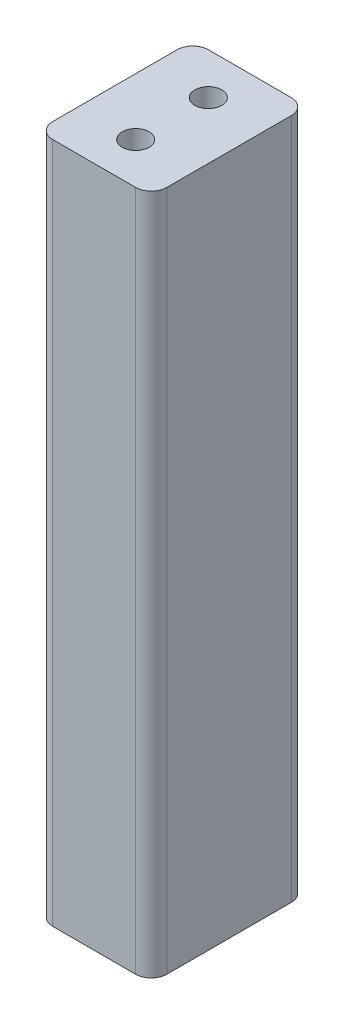
ISO-10303-21;
HEADER;
FILE_DESCRIPTION(('STEP AP214'),'2;1');
FILE_NAME('part.step','',(''),(''),'','','');
FILE_SCHEMA(('AUTOMOTIVE_DESIGN { 1 0 10303 214 1 1 1 1 }'));
ENDSEC;
DATA;
#1=APPLICATION_CONTEXT('core data for automotive mechanical design processes');
#2=APPLICATION_PROTOCOL_DEFINITION('international standard','automotive_design',2000,#1);
#3=PRODUCT_CONTEXT('',#1,'mechanical');
#4=PRODUCT('Part','Part','',(#3));
#5=PRODUCT_RELATED_PRODUCT_CATEGORY('part','',(#4));
#6=PRODUCT_DEFINITION_FORMATION('','',#4);
#7=PRODUCT_DEFINITION_CONTEXT('part definition',#1,'design');
#8=PRODUCT_DEFINITION('design','',#6,#7);
#9=PRODUCT_DEFINITION_SHAPE('','',#8);
#10=(LENGTH_UNIT() NAMED_UNIT(*) SI_UNIT(.MILLI.,.METRE.));
#11=(NAMED_UNIT(*) PLANE_ANGLE_UNIT() SI_UNIT($,.RADIAN.));
#12=(NAMED_UNIT(*) SI_UNIT($,.STERADIAN.) SOLID_ANGLE_UNIT());
#13=UNCERTAINTY_MEASURE_WITH_UNIT(LENGTH_MEASURE(1.E-05),#10,'distance_accuracy_value','');
#14=(GEOMETRIC_REPRESENTATION_CONTEXT(3) GLOBAL_UNCERTAINTY_ASSIGNED_CONTEXT((#13)) GLOBAL_UNIT_ASSIGNED_CONTEXT((#10,
#11,#12)) REPRESENTATION_CONTEXT('',''));
#15=CARTESIAN_POINT('',(0.,0.,0.));
#16=DIRECTION('',(0.,0.,1.));
#17=DIRECTION('',(1.,0.,0.));
#18=AXIS2_PLACEMENT_3D('',#15,#16,#17);
#19=CARTESIAN_POINT('',(18.5,509.69,466.5));
#20=DIRECTION('',(0.,-1.,0.));
#21=DIRECTION('',(0.,0.,-1.));
#22=AXIS2_PLACEMENT_3D('',#19,#20,#21);
#23=PLANE('',#22);
#24=CARTESIAN_POINT('',(18.5,509.69,466.5));
#25=DIRECTION('',(0.,-1.,0.));
#26=DIRECTION('',(1.,0.,0.));
#27=AXIS2_PLACEMENT_3D('',#24,#25,#26);
#28=CIRCLE('',#27,1.3);
#29=CARTESIAN_POINT('',(19.8,509.69,466.5));
#30=VERTEX_POINT('',#29);
#31=EDGE_CURVE('E9',#30,#30,#28,.T.);
#32=ORIENTED_EDGE('',*,*,#31,.F.);
#33=EDGE_LOOP('',(#32));
#34=FACE_BOUND('',#33,.T.);
#35=ADVANCED_FACE('F15',(#34),#23,.F.);
#36=CARTESIAN_POINT('',(18.5,509.69,459.5));
#37=DIRECTION('',(0.,-1.,0.));
#38=DIRECTION('',(0.,0.,-1.));
#39=AXIS2_PLACEMENT_3D('',#36,#37,#38);
#40=PLANE('',#39);
#41=CARTESIAN_POINT('',(18.5,509.69,459.5));
#42=DIRECTION('',(0.,-1.,0.));
#43=DIRECTION('',(1.,0.,0.));
#44=AXIS2_PLACEMENT_3D('',#41,#42,#43);
#45=CIRCLE('',#44,1.3);
#46=CARTESIAN_POINT('',(19.8,509.69,459.5));
#47=VERTEX_POINT('',#46);
#48=EDGE_CURVE('E43',#47,#47,#45,.T.);
#49=ORIENTED_EDGE('',*,*,#48,.F.);
#50=EDGE_LOOP('',(#49));
#51=FACE_BOUND('',#50,.T.);
#52=ADVANCED_FACE('F17',(#51),#40,.F.);
#53=CARTESIAN_POINT('',(18.5,471.,463.));
#54=DIRECTION('',(0.,-1.,0.));
#55=DIRECTION('',(0.,0.,-1.));
#56=AXIS2_PLACEMENT_3D('',#53,#54,#55);
#57=PLANE('',#56);
#58=CARTESIAN_POINT('',(18.5,471.,463.));
#59=DIRECTION('',(0.,-1.,0.));
#60=DIRECTION('',(1.,0.,0.));
#61=AXIS2_PLACEMENT_3D('',#58,#59,#60);
#62=CIRCLE('',#61,1.3);
#63=CARTESIAN_POINT('',(19.8,471.,463.));
#64=VERTEX_POINT('',#63);
#65=EDGE_CURVE('E243',#64,#64,#62,.T.);
#66=ORIENTED_EDGE('',*,*,#65,.T.);
#67=EDGE_LOOP('',(#66));
#68=FACE_BOUND('',#67,.T.);
#69=ADVANCED_FACE('F294',(#68),#57,.T.);
#70=CARTESIAN_POINT('',(18.5,509.69,466.5));
#71=DIRECTION('',(0.,-1.,0.));
#72=DIRECTION('',(1.,0.,0.));
#73=AXIS2_PLACEMENT_3D('',#70,#71,#72);
#74=CYLINDRICAL_SURFACE('',#73,1.3);
#75=DIRECTION('',(0.,1.,0.));
#76=VECTOR('',#75,1.);
#77=CARTESIAN_POINT('',(19.8,509.69,466.5));
#78=LINE('',#77,#76);
#79=CARTESIAN_POINT('',(19.8,524.69,466.5));
#80=VERTEX_POINT('',#79);
#81=EDGE_CURVE('E24',#30,#80,#78,.T.);
#82=ORIENTED_EDGE('',*,*,#81,.T.);
#83=CARTESIAN_POINT('',(18.5,524.69,466.5));
#84=DIRECTION('',(0.,-1.,0.));
#85=DIRECTION('',(1.,0.,0.));
#86=AXIS2_PLACEMENT_3D('',#83,#84,#85);
#87=CIRCLE('',#86,1.3);
#88=EDGE_CURVE('E229',#80,#80,#87,.T.);
#89=ORIENTED_EDGE('',*,*,#88,.F.);
#90=ORIENTED_EDGE('',*,*,#81,.F.);
#91=ORIENTED_EDGE('',*,*,#31,.T.);
#92=EDGE_LOOP('',(#82,#89,#90,#91));
#93=FACE_BOUND('',#92,.T.);
#94=ADVANCED_FACE('F303',(#93),#74,.F.);
#95=CARTESIAN_POINT('',(18.5,509.69,459.5));
#96=DIRECTION('',(0.,-1.,0.));
#97=DIRECTION('',(1.,0.,0.));
#98=AXIS2_PLACEMENT_3D('',#95,#96,#97);
#99=CYLINDRICAL_SURFACE('',#98,1.3);
#100=DIRECTION('',(0.,1.,0.));
#101=VECTOR('',#100,1.);
#102=CARTESIAN_POINT('',(19.8,509.69,459.5));
#103=LINE('',#102,#101);
#104=CARTESIAN_POINT('',(19.8,524.69,459.5));
#105=VERTEX_POINT('',#104);
#106=EDGE_CURVE('E202',#47,#105,#103,.T.);
#107=ORIENTED_EDGE('',*,*,#106,.T.);
#108=CARTESIAN_POINT('',(18.5,524.69,459.5));
#109=DIRECTION('',(0.,-1.,0.));
#110=DIRECTION('',(1.,0.,0.));
#111=AXIS2_PLACEMENT_3D('',#108,#109,#110);
#112=CIRCLE('',#111,1.3);
#113=EDGE_CURVE('E225',#105,#105,#112,.T.);
#114=ORIENTED_EDGE('',*,*,#113,.F.);
#115=ORIENTED_EDGE('',*,*,#106,.F.);
#116=ORIENTED_EDGE('',*,*,#48,.T.);
#117=EDGE_LOOP('',(#107,#114,#115,#116));
#118=FACE_BOUND('',#117,.T.);
#119=ADVANCED_FACE('F254',(#118),#99,.F.);
#120=CARTESIAN_POINT('',(18.5,458.,463.));
#121=DIRECTION('',(0.,-1.,0.));
#122=DIRECTION('',(1.,0.,0.));
#123=AXIS2_PLACEMENT_3D('',#120,#121,#122);
#124=CYLINDRICAL_SURFACE('',#123,1.3);
#125=DIRECTION('',(0.,1.,0.));
#126=VECTOR('',#125,1.);
#127=CARTESIAN_POINT('',(19.8,458.,463.));
#128=LINE('',#127,#126);
#129=CARTESIAN_POINT('',(19.8,459.,463.));
#130=VERTEX_POINT('',#129);
#131=EDGE_CURVE('E246',#130,#64,#128,.T.);
#132=ORIENTED_EDGE('',*,*,#131,.T.);
#133=ORIENTED_EDGE('',*,*,#65,.F.);
#134=ORIENTED_EDGE('',*,*,#131,.F.);
#135=CARTESIAN_POINT('',(18.5,459.,463.));
#136=DIRECTION('',(0.,-1.,0.));
#137=DIRECTION('',(1.,0.,0.));
#138=AXIS2_PLACEMENT_3D('',#135,#136,#137);
#139=CIRCLE('',#138,1.3);
#140=EDGE_CURVE('E168',#130,#130,#139,.T.);
#141=ORIENTED_EDGE('',*,*,#140,.T.);
#142=EDGE_LOOP('',(#132,#133,#134,#141));
#143=FACE_BOUND('',#142,.T.);
#144=ADVANCED_FACE('F301',(#143),#124,.F.);
#145=CARTESIAN_POINT('',(13.,459.,470.5));
#146=DIRECTION('',(0.,0.,1.));
#147=DIRECTION('',(1.,0.,0.));
#148=AXIS2_PLACEMENT_3D('',#145,#146,#147);
#149=PLANE('',#148);
#150=DIRECTION('',(1.,0.,0.));
#151=VECTOR('',#150,1.);
#152=CARTESIAN_POINT('',(13.,524.69,470.5));
#153=LINE('',#152,#151);
#154=CARTESIAN_POINT('',(14.5,524.69,470.5));
#155=VERTEX_POINT('',#154);
#156=CARTESIAN_POINT('',(22.5,524.69,470.5));
#157=VERTEX_POINT('',#156);
#158=EDGE_CURVE('E209',#155,#157,#153,.T.);
#159=ORIENTED_EDGE('',*,*,#158,.F.);
#160=DIRECTION('',(0.,1.,0.));
#161=VECTOR('',#160,1.);
#162=CARTESIAN_POINT('',(14.5,459.,470.5));
#163=LINE('',#162,#161);
#164=CARTESIAN_POINT('',(14.5,459.,470.5));
#165=VERTEX_POINT('',#164);
#166=EDGE_CURVE('E190',#165,#155,#163,.T.);
#167=ORIENTED_EDGE('',*,*,#166,.F.);
#168=DIRECTION('',(1.,0.,0.));
#169=VECTOR('',#168,1.);
#170=CARTESIAN_POINT('',(13.,459.,470.5));
#171=LINE('',#170,#169);
#172=CARTESIAN_POINT('',(22.5,459.,470.5));
#173=VERTEX_POINT('',#172);
#174=EDGE_CURVE('E135',#165,#173,#171,.T.);
#175=ORIENTED_EDGE('',*,*,#174,.T.);
#176=DIRECTION('',(0.,1.,0.));
#177=VECTOR('',#176,1.);
#178=CARTESIAN_POINT('',(22.5,459.,470.5));
#179=LINE('',#178,#177);
#180=EDGE_CURVE('E242',#173,#157,#179,.T.);
#181=ORIENTED_EDGE('',*,*,#180,.T.);
#182=EDGE_LOOP('',(#159,#167,#175,#181));
#183=FACE_BOUND('',#182,.T.);
#184=ADVANCED_FACE('F270',(#183),#149,.T.);
#185=CARTESIAN_POINT('',(22.5,459.,469.));
#186=DIRECTION('',(0.,1.,0.));
#187=DIRECTION('',(1.,0.,0.));
#188=AXIS2_PLACEMENT_3D('',#185,#186,#187);
#189=CYLINDRICAL_SURFACE('',#188,1.5);
#190=DIRECTION('',(0.,1.,0.));
#191=VECTOR('',#190,1.);
#192=CARTESIAN_POINT('',(24.,459.,469.));
#193=LINE('',#192,#191);
#194=CARTESIAN_POINT('',(24.,459.,469.));
#195=VERTEX_POINT('',#194);
#196=CARTESIAN_POINT('',(24.,524.69,469.));
#197=VERTEX_POINT('',#196);
#198=EDGE_CURVE('E239',#195,#197,#193,.T.);
#199=ORIENTED_EDGE('',*,*,#198,.T.);
#200=CARTESIAN_POINT('',(22.5,524.69,469.));
#201=DIRECTION('',(0.,-1.,0.));
#202=DIRECTION('',(0.,0.,1.));
#203=AXIS2_PLACEMENT_3D('',#200,#201,#202);
#204=CIRCLE('',#203,1.5);
#205=EDGE_CURVE('E213',#197,#157,#204,.T.);
#206=ORIENTED_EDGE('',*,*,#205,.T.);
#207=ORIENTED_EDGE('',*,*,#180,.F.);
#208=CARTESIAN_POINT('',(22.5,459.,469.));
#209=DIRECTION('',(0.,-1.,0.));
#210=DIRECTION('',(0.,0.,1.));
#211=AXIS2_PLACEMENT_3D('',#208,#209,#210);
#212=CIRCLE('',#211,1.5);
#213=EDGE_CURVE('E183',#195,#173,#212,.T.);
#214=ORIENTED_EDGE('',*,*,#213,.F.);
#215=EDGE_LOOP('',(#199,#206,#207,#214));
#216=FACE_BOUND('',#215,.T.);
#217=ADVANCED_FACE('F273',(#216),#189,.T.);
#218=CARTESIAN_POINT('',(24.,459.,455.5));
#219=DIRECTION('',(1.,0.,0.));
#220=DIRECTION('',(0.,1.,0.));
#221=AXIS2_PLACEMENT_3D('',#218,#219,#220);
#222=PLANE('',#221);
#223=DIRECTION('',(0.,0.,1.));
#224=VECTOR('',#223,1.);
#225=CARTESIAN_POINT('',(24.,459.,455.5));
#226=LINE('',#225,#224);
#227=CARTESIAN_POINT('',(24.,459.,457.));
#228=VERTEX_POINT('',#227);
#229=EDGE_CURVE('E176',#228,#195,#226,.T.);
#230=ORIENTED_EDGE('',*,*,#229,.F.);
#231=DIRECTION('',(0.,1.,0.));
#232=VECTOR('',#231,1.);
#233=CARTESIAN_POINT('',(24.,459.,457.));
#234=LINE('',#233,#232);
#235=CARTESIAN_POINT('',(24.,524.69,457.));
#236=VERTEX_POINT('',#235);
#237=EDGE_CURVE('E236',#228,#236,#234,.T.);
#238=ORIENTED_EDGE('',*,*,#237,.T.);
#239=DIRECTION('',(0.,0.,1.));
#240=VECTOR('',#239,1.);
#241=CARTESIAN_POINT('',(24.,524.69,455.5));
#242=LINE('',#241,#240);
#243=EDGE_CURVE('E217',#236,#197,#242,.T.);
#244=ORIENTED_EDGE('',*,*,#243,.T.);
#245=ORIENTED_EDGE('',*,*,#198,.F.);
#246=EDGE_LOOP('',(#230,#238,#244,#245));
#247=FACE_BOUND('',#246,.T.);
#248=ADVANCED_FACE('F276',(#247),#222,.T.);
#249=CARTESIAN_POINT('',(22.5,459.,457.));
#250=DIRECTION('',(0.,1.,0.));
#251=DIRECTION('',(1.,0.,0.));
#252=AXIS2_PLACEMENT_3D('',#249,#250,#251);
#253=CYLINDRICAL_SURFACE('',#252,1.5);
#254=CARTESIAN_POINT('',(22.5,459.,457.));
#255=DIRECTION('',(0.,1.,0.));
#256=DIRECTION('',(0.,0.,1.));
#257=AXIS2_PLACEMENT_3D('',#254,#255,#256);
#258=CIRCLE('',#257,1.5);
#259=CARTESIAN_POINT('',(22.5,459.,455.5));
#260=VERTEX_POINT('',#259);
#261=EDGE_CURVE('E150',#228,#260,#258,.T.);
#262=ORIENTED_EDGE('',*,*,#261,.T.);
#263=DIRECTION('',(0.,1.,0.));
#264=VECTOR('',#263,1.);
#265=CARTESIAN_POINT('',(22.5,459.,455.5));
#266=LINE('',#265,#264);
#267=CARTESIAN_POINT('',(22.5,524.69,455.5));
#268=VERTEX_POINT('',#267);
#269=EDGE_CURVE('E233',#260,#268,#266,.T.);
#270=ORIENTED_EDGE('',*,*,#269,.T.);
#271=CARTESIAN_POINT('',(22.5,524.69,457.));
#272=DIRECTION('',(0.,1.,0.));
#273=DIRECTION('',(0.,0.,1.));
#274=AXIS2_PLACEMENT_3D('',#271,#272,#273);
#275=CIRCLE('',#274,1.5);
#276=EDGE_CURVE('E221',#236,#268,#275,.T.);
#277=ORIENTED_EDGE('',*,*,#276,.F.);
#278=ORIENTED_EDGE('',*,*,#237,.F.);
#279=EDGE_LOOP('',(#262,#270,#277,#278));
#280=FACE_BOUND('',#279,.T.);
#281=ADVANCED_FACE('F278',(#280),#253,.T.);
#282=CARTESIAN_POINT('',(13.,459.,455.5));
#283=DIRECTION('',(0.,0.,1.));
#284=DIRECTION('',(1.,0.,0.));
#285=AXIS2_PLACEMENT_3D('',#282,#283,#284);
#286=PLANE('',#285);
#287=ORIENTED_EDGE('',*,*,#269,.F.);
#288=DIRECTION('',(1.,0.,0.));
#289=VECTOR('',#288,1.);
#290=CARTESIAN_POINT('',(13.,459.,455.5));
#291=LINE('',#290,#289);
#292=CARTESIAN_POINT('',(14.5,459.,455.5));
#293=VERTEX_POINT('',#292);
#294=EDGE_CURVE('E166',#293,#260,#291,.T.);
#295=ORIENTED_EDGE('',*,*,#294,.F.);
#296=DIRECTION('',(0.,1.,0.));
#297=VECTOR('',#296,1.);
#298=CARTESIAN_POINT('',(14.5,459.,455.5));
#299=LINE('',#298,#297);
#300=CARTESIAN_POINT('',(14.5,524.69,455.5));
#301=VERTEX_POINT('',#300);
#302=EDGE_CURVE('E193',#293,#301,#299,.T.);
#303=ORIENTED_EDGE('',*,*,#302,.T.);
#304=DIRECTION('',(1.,0.,0.));
#305=VECTOR('',#304,1.);
#306=CARTESIAN_POINT('',(13.,524.69,455.5));
#307=LINE('',#306,#305);
#308=EDGE_CURVE('E205',#301,#268,#307,.T.);
#309=ORIENTED_EDGE('',*,*,#308,.T.);
#310=EDGE_LOOP('',(#287,#295,#303,#309));
#311=FACE_BOUND('',#310,.T.);
#312=ADVANCED_FACE('F259',(#311),#286,.F.);
#313=CARTESIAN_POINT('',(13.,524.69,455.5));
#314=DIRECTION('',(0.,1.,0.));
#315=DIRECTION('',(1.,0.,0.));
#316=AXIS2_PLACEMENT_3D('',#313,#314,#315);
#317=PLANE('',#316);
#318=ORIENTED_EDGE('',*,*,#88,.T.);
#319=EDGE_LOOP('',(#318));
#320=FACE_BOUND('',#319,.T.);
#321=ORIENTED_EDGE('',*,*,#113,.T.);
#322=EDGE_LOOP('',(#321));
#323=FACE_BOUND('',#322,.T.);
#324=ORIENTED_EDGE('',*,*,#308,.F.);
#325=CARTESIAN_POINT('',(14.5,524.69,457.));
#326=DIRECTION('',(0.,-1.,0.));
#327=DIRECTION('',(0.,0.,1.));
#328=AXIS2_PLACEMENT_3D('',#325,#326,#327);
#329=CIRCLE('',#328,1.5);
#330=CARTESIAN_POINT('',(13.,524.69,457.));
#331=VERTEX_POINT('',#330);
#332=EDGE_CURVE('E172',#331,#301,#329,.T.);
#333=ORIENTED_EDGE('',*,*,#332,.F.);
#334=DIRECTION('',(0.,0.,1.));
#335=VECTOR('',#334,1.);
#336=CARTESIAN_POINT('',(13.,524.69,455.5));
#337=LINE('',#336,#335);
#338=CARTESIAN_POINT('',(13.,524.69,469.));
#339=VERTEX_POINT('',#338);
#340=EDGE_CURVE('E157',#331,#339,#337,.T.);
#341=ORIENTED_EDGE('',*,*,#340,.T.);
#342=CARTESIAN_POINT('',(14.5,524.69,469.));
#343=DIRECTION('',(0.,1.,0.));
#344=DIRECTION('',(0.,0.,1.));
#345=AXIS2_PLACEMENT_3D('',#342,#343,#344);
#346=CIRCLE('',#345,1.5);
#347=EDGE_CURVE('E154',#339,#155,#346,.T.);
#348=ORIENTED_EDGE('',*,*,#347,.T.);
#349=ORIENTED_EDGE('',*,*,#158,.T.);
#350=ORIENTED_EDGE('',*,*,#205,.F.);
#351=ORIENTED_EDGE('',*,*,#243,.F.);
#352=ORIENTED_EDGE('',*,*,#276,.T.);
#353=EDGE_LOOP('',(#324,#333,#341,#348,#349,#350,#351,#352));
#354=FACE_BOUND('',#353,.T.);
#355=ADVANCED_FACE('F256',(#320,#323,#354),#317,.T.);
#356=CARTESIAN_POINT('',(14.5,459.,469.));
#357=DIRECTION('',(0.,1.,0.));
#358=DIRECTION('',(-1.,0.,0.));
#359=AXIS2_PLACEMENT_3D('',#356,#357,#358);
#360=CYLINDRICAL_SURFACE('',#359,1.5);
#361=CARTESIAN_POINT('',(14.5,459.,469.));
#362=DIRECTION('',(0.,1.,0.));
#363=DIRECTION('',(0.,0.,1.));
#364=AXIS2_PLACEMENT_3D('',#361,#362,#363);
#365=CIRCLE('',#364,1.5);
#366=CARTESIAN_POINT('',(13.,459.,469.));
#367=VERTEX_POINT('',#366);
#368=EDGE_CURVE('E126',#367,#165,#365,.T.);
#369=ORIENTED_EDGE('',*,*,#368,.T.);
#370=ORIENTED_EDGE('',*,*,#166,.T.);
#371=ORIENTED_EDGE('',*,*,#347,.F.);
#372=DIRECTION('',(0.,1.,0.));
#373=VECTOR('',#372,1.);
#374=CARTESIAN_POINT('',(13.,459.,469.));
#375=LINE('',#374,#373);
#376=EDGE_CURVE('E146',#367,#339,#375,.T.);
#377=ORIENTED_EDGE('',*,*,#376,.F.);
#378=EDGE_LOOP('',(#369,#370,#371,#377));
#379=FACE_BOUND('',#378,.T.);
#380=ADVANCED_FACE('F152',(#379),#360,.T.);
#381=CARTESIAN_POINT('',(14.5,459.,457.));
#382=DIRECTION('',(0.,1.,0.));
#383=DIRECTION('',(-1.,0.,0.));
#384=AXIS2_PLACEMENT_3D('',#381,#382,#383);
#385=CYLINDRICAL_SURFACE('',#384,1.5);
#386=DIRECTION('',(0.,1.,0.));
#387=VECTOR('',#386,1.);
#388=CARTESIAN_POINT('',(13.,459.,457.));
#389=LINE('',#388,#387);
#390=CARTESIAN_POINT('',(13.,459.,457.));
#391=VERTEX_POINT('',#390);
#392=EDGE_CURVE('E148',#391,#331,#389,.T.);
#393=ORIENTED_EDGE('',*,*,#392,.T.);
#394=ORIENTED_EDGE('',*,*,#332,.T.);
#395=ORIENTED_EDGE('',*,*,#302,.F.);
#396=CARTESIAN_POINT('',(14.5,459.,457.));
#397=DIRECTION('',(0.,-1.,0.));
#398=DIRECTION('',(0.,0.,1.));
#399=AXIS2_PLACEMENT_3D('',#396,#397,#398);
#400=CIRCLE('',#399,1.5);
#401=EDGE_CURVE('E140',#391,#293,#400,.T.);
#402=ORIENTED_EDGE('',*,*,#401,.F.);
#403=EDGE_LOOP('',(#393,#394,#395,#402));
#404=FACE_BOUND('',#403,.T.);
#405=ADVANCED_FACE('F267',(#404),#385,.T.);
#406=CARTESIAN_POINT('',(13.,459.,455.5));
#407=DIRECTION('',(0.,1.,0.));
#408=DIRECTION('',(1.,0.,0.));
#409=AXIS2_PLACEMENT_3D('',#406,#407,#408);
#410=PLANE('',#409);
#411=ORIENTED_EDGE('',*,*,#140,.F.);
#412=EDGE_LOOP('',(#411));
#413=FACE_BOUND('',#412,.T.);
#414=ORIENTED_EDGE('',*,*,#261,.F.);
#415=ORIENTED_EDGE('',*,*,#229,.T.);
#416=ORIENTED_EDGE('',*,*,#213,.T.);
#417=ORIENTED_EDGE('',*,*,#174,.F.);
#418=ORIENTED_EDGE('',*,*,#368,.F.);
#419=DIRECTION('',(0.,0.,1.));
#420=VECTOR('',#419,1.);
#421=CARTESIAN_POINT('',(13.,459.,455.5));
#422=LINE('',#421,#420);
#423=EDGE_CURVE('E131',#391,#367,#422,.T.);
#424=ORIENTED_EDGE('',*,*,#423,.F.);
#425=ORIENTED_EDGE('',*,*,#401,.T.);
#426=ORIENTED_EDGE('',*,*,#294,.T.);
#427=EDGE_LOOP('',(#414,#415,#416,#417,#418,#424,#425,#426));
#428=FACE_BOUND('',#427,.T.);
#429=ADVANCED_FACE('F129',(#413,#428),#410,.F.);
#430=CARTESIAN_POINT('',(13.,459.,455.5));
#431=DIRECTION('',(1.,0.,0.));
#432=DIRECTION('',(0.,1.,0.));
#433=AXIS2_PLACEMENT_3D('',#430,#431,#432);
#434=PLANE('',#433);
#435=ORIENTED_EDGE('',*,*,#376,.T.);
#436=ORIENTED_EDGE('',*,*,#340,.F.);
#437=ORIENTED_EDGE('',*,*,#392,.F.);
#438=ORIENTED_EDGE('',*,*,#423,.T.);
#439=EDGE_LOOP('',(#435,#436,#437,#438));
#440=FACE_BOUND('',#439,.T.);
#441=ADVANCED_FACE('F144',(#440),#434,.F.);
#442=CLOSED_SHELL('',(#35,#52,#69,#94,#119,#144,#184,#217,#248,#281,#312,#355,#380,#405,#429,#441));
#443=MANIFOLD_SOLID_BREP('B1',#442);
#444=ADVANCED_BREP_SHAPE_REPRESENTATION('',(#18,#443),#14);
#445=SHAPE_DEFINITION_REPRESENTATION(#9,#444);
ENDSEC;
END-ISO-10303-21;
